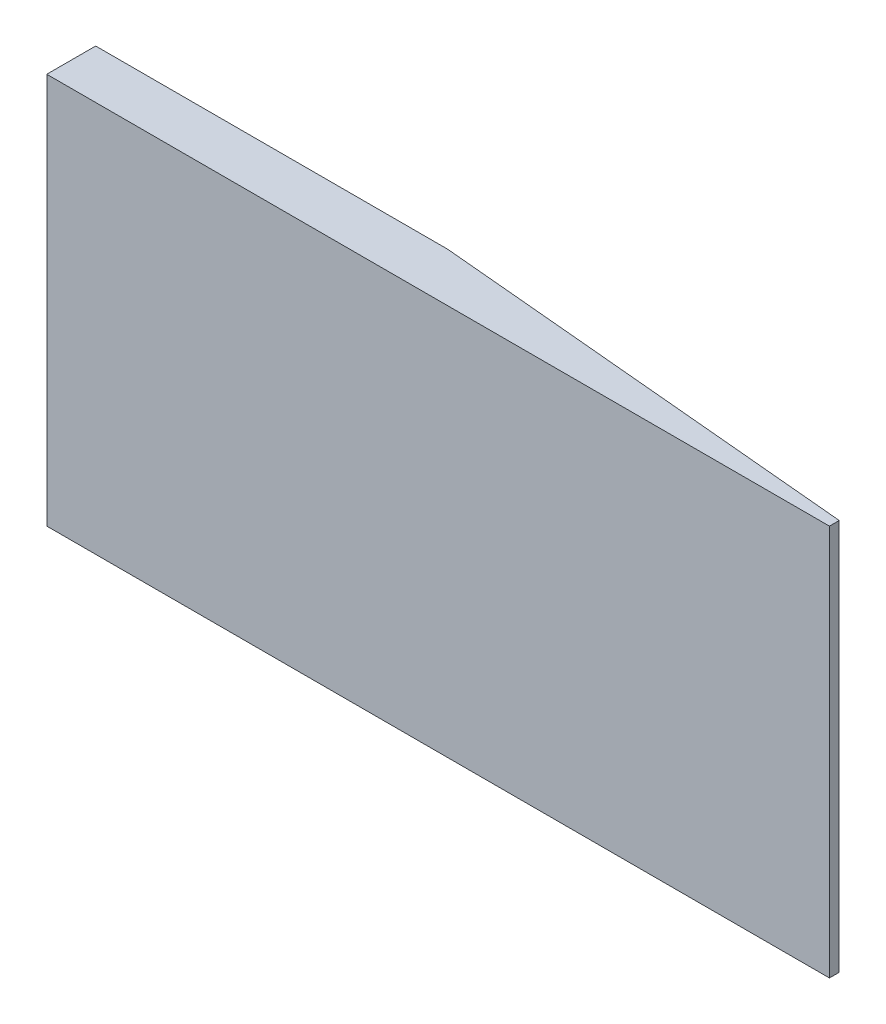
ISO-10303-21;
HEADER;
FILE_DESCRIPTION(('STEP AP214'),'2;1');
FILE_NAME('part.step','',(''),(''),'','','');
FILE_SCHEMA(('AUTOMOTIVE_DESIGN { 1 0 10303 214 1 1 1 1 }'));
ENDSEC;
DATA;
#1=APPLICATION_CONTEXT('core data for automotive mechanical design processes');
#2=APPLICATION_PROTOCOL_DEFINITION('international standard','automotive_design',2000,#1);
#3=PRODUCT_CONTEXT('',#1,'mechanical');
#4=PRODUCT('Part','Part','',(#3));
#5=PRODUCT_RELATED_PRODUCT_CATEGORY('part','',(#4));
#6=PRODUCT_DEFINITION_FORMATION('','',#4);
#7=PRODUCT_DEFINITION_CONTEXT('part definition',#1,'design');
#8=PRODUCT_DEFINITION('design','',#6,#7);
#9=PRODUCT_DEFINITION_SHAPE('','',#8);
#10=(LENGTH_UNIT() NAMED_UNIT(*) SI_UNIT(.MILLI.,.METRE.));
#11=(NAMED_UNIT(*) PLANE_ANGLE_UNIT() SI_UNIT($,.RADIAN.));
#12=(NAMED_UNIT(*) SI_UNIT($,.STERADIAN.) SOLID_ANGLE_UNIT());
#13=UNCERTAINTY_MEASURE_WITH_UNIT(LENGTH_MEASURE(1.E-05),#10,'distance_accuracy_value','');
#14=(GEOMETRIC_REPRESENTATION_CONTEXT(3) GLOBAL_UNCERTAINTY_ASSIGNED_CONTEXT((#13)) GLOBAL_UNIT_ASSIGNED_CONTEXT((#10,
#11,#12)) REPRESENTATION_CONTEXT('',''));
#15=CARTESIAN_POINT('',(0.,0.,0.));
#16=DIRECTION('',(0.,0.,1.));
#17=DIRECTION('',(1.,0.,0.));
#18=AXIS2_PLACEMENT_3D('',#15,#16,#17);
#19=CARTESIAN_POINT('',(194.704652045804,14.2875,3.175));
#20=DIRECTION('',(1.,0.,0.));
#21=DIRECTION('',(0.,0.,-1.));
#22=AXIS2_PLACEMENT_3D('',#19,#20,#21);
#23=PLANE('',#22);
#24=DIRECTION('',(0.,-1.,0.));
#25=VECTOR('',#24,1.);
#26=CARTESIAN_POINT('',(194.704652045804,14.2875,0.));
#27=LINE('',#26,#25);
#28=CARTESIAN_POINT('',(194.704652045804,14.2875,0.));
#29=VERTEX_POINT('',#28);
#30=CARTESIAN_POINT('',(194.704652045804,-11.1125,0.));
#31=VERTEX_POINT('',#30);
#32=EDGE_CURVE('E110',#29,#31,#27,.T.);
#33=ORIENTED_EDGE('',*,*,#32,.T.);
#34=DIRECTION('',(0.,0.,-1.));
#35=VECTOR('',#34,1.);
#36=CARTESIAN_POINT('',(194.704652045804,-11.1125,3.175));
#37=LINE('',#36,#35);
#38=CARTESIAN_POINT('',(194.704652045804,-11.1125,3.175));
#39=VERTEX_POINT('',#38);
#40=EDGE_CURVE('E91',#39,#31,#37,.T.);
#41=ORIENTED_EDGE('',*,*,#40,.F.);
#42=DIRECTION('',(0.,-1.,0.));
#43=VECTOR('',#42,1.);
#44=CARTESIAN_POINT('',(194.704652045804,14.2875,3.175));
#45=LINE('',#44,#43);
#46=CARTESIAN_POINT('',(194.704652045804,14.2875,3.175));
#47=VERTEX_POINT('',#46);
#48=EDGE_CURVE('E98',#47,#39,#45,.T.);
#49=ORIENTED_EDGE('',*,*,#48,.F.);
#50=DIRECTION('',(0.,0.,-1.));
#51=VECTOR('',#50,1.);
#52=CARTESIAN_POINT('',(194.704652045804,14.2875,3.175));
#53=LINE('',#52,#51);
#54=EDGE_CURVE('E120',#47,#29,#53,.T.);
#55=ORIENTED_EDGE('',*,*,#54,.T.);
#56=EDGE_LOOP('',(#33,#41,#49,#55));
#57=FACE_BOUND('',#56,.T.);
#58=ADVANCED_FACE('F41',(#57),#23,.F.);
#59=CARTESIAN_POINT('',(194.704652045804,-11.1125,3.175));
#60=DIRECTION('',(0.,1.,0.));
#61=DIRECTION('',(0.,0.,1.));
#62=AXIS2_PLACEMENT_3D('',#59,#60,#61);
#63=PLANE('',#62);
#64=DIRECTION('',(1.,0.,0.));
#65=VECTOR('',#64,1.);
#66=CARTESIAN_POINT('',(194.704652045804,-11.1125,0.));
#67=LINE('',#66,#65);
#68=CARTESIAN_POINT('',(217.564652045803,-11.1125,0.));
#69=VERTEX_POINT('',#68);
#70=EDGE_CURVE('E123',#31,#69,#67,.T.);
#71=ORIENTED_EDGE('',*,*,#70,.T.);
#72=DIRECTION('',(-0.995893206467704,0.,-0.0905357460425151));
#73=VECTOR('',#72,1.);
#74=CARTESIAN_POINT('',(245.504652045804,-11.1125,2.54));
#75=LINE('',#74,#73);
#76=CARTESIAN_POINT('',(245.504652045804,-11.1125,2.54));
#77=VERTEX_POINT('',#76);
#78=EDGE_CURVE('E11',#69,#77,#75,.F.);
#79=ORIENTED_EDGE('',*,*,#78,.T.);
#80=DIRECTION('',(0.,0.,-1.));
#81=VECTOR('',#80,1.);
#82=CARTESIAN_POINT('',(245.504652045804,-11.1125,3.175));
#83=LINE('',#82,#81);
#84=CARTESIAN_POINT('',(245.504652045804,-11.1125,3.175));
#85=VERTEX_POINT('',#84);
#86=EDGE_CURVE('E94',#85,#77,#83,.T.);
#87=ORIENTED_EDGE('',*,*,#86,.F.);
#88=DIRECTION('',(1.,0.,0.));
#89=VECTOR('',#88,1.);
#90=CARTESIAN_POINT('',(194.704652045804,-11.1125,3.175));
#91=LINE('',#90,#89);
#92=EDGE_CURVE('E87',#39,#85,#91,.T.);
#93=ORIENTED_EDGE('',*,*,#92,.F.);
#94=ORIENTED_EDGE('',*,*,#40,.T.);
#95=EDGE_LOOP('',(#71,#79,#87,#93,#94));
#96=FACE_BOUND('',#95,.T.);
#97=ADVANCED_FACE('F89',(#96),#63,.F.);
#98=CARTESIAN_POINT('',(245.504652045804,14.2875,3.175));
#99=DIRECTION('',(-1.,0.,0.));
#100=DIRECTION('',(0.,0.,1.));
#101=AXIS2_PLACEMENT_3D('',#98,#99,#100);
#102=PLANE('',#101);
#103=ORIENTED_EDGE('',*,*,#86,.T.);
#104=DIRECTION('',(0.,1.,0.));
#105=VECTOR('',#104,1.);
#106=CARTESIAN_POINT('',(245.504652045804,14.2875,2.54));
#107=LINE('',#106,#105);
#108=CARTESIAN_POINT('',(245.504652045804,14.2875,2.54));
#109=VERTEX_POINT('',#108);
#110=EDGE_CURVE('E111',#77,#109,#107,.T.);
#111=ORIENTED_EDGE('',*,*,#110,.T.);
#112=DIRECTION('',(0.,0.,-1.));
#113=VECTOR('',#112,1.);
#114=CARTESIAN_POINT('',(245.504652045804,14.2875,3.175));
#115=LINE('',#114,#113);
#116=CARTESIAN_POINT('',(245.504652045804,14.2875,3.175));
#117=VERTEX_POINT('',#116);
#118=EDGE_CURVE('E115',#117,#109,#115,.T.);
#119=ORIENTED_EDGE('',*,*,#118,.F.);
#120=DIRECTION('',(0.,1.,0.));
#121=VECTOR('',#120,1.);
#122=CARTESIAN_POINT('',(245.504652045804,14.2875,3.175));
#123=LINE('',#122,#121);
#124=EDGE_CURVE('E97',#85,#117,#123,.T.);
#125=ORIENTED_EDGE('',*,*,#124,.F.);
#126=EDGE_LOOP('',(#103,#111,#119,#125));
#127=FACE_BOUND('',#126,.T.);
#128=ADVANCED_FACE('F129',(#127),#102,.F.);
#129=CARTESIAN_POINT('',(194.704652045804,14.2875,3.175));
#130=DIRECTION('',(0.,-1.,0.));
#131=DIRECTION('',(0.,0.,-1.));
#132=AXIS2_PLACEMENT_3D('',#129,#130,#131);
#133=PLANE('',#132);
#134=ORIENTED_EDGE('',*,*,#118,.T.);
#135=DIRECTION('',(0.995893206467704,0.,0.0905357460425151));
#136=VECTOR('',#135,1.);
#137=CARTESIAN_POINT('',(245.504652045804,14.2875,2.54));
#138=LINE('',#137,#136);
#139=CARTESIAN_POINT('',(217.564652045803,14.2875,0.));
#140=VERTEX_POINT('',#139);
#141=EDGE_CURVE('E64',#109,#140,#138,.F.);
#142=ORIENTED_EDGE('',*,*,#141,.T.);
#143=DIRECTION('',(-1.,0.,0.));
#144=VECTOR('',#143,1.);
#145=CARTESIAN_POINT('',(194.704652045804,14.2875,0.));
#146=LINE('',#145,#144);
#147=EDGE_CURVE('E107',#140,#29,#146,.T.);
#148=ORIENTED_EDGE('',*,*,#147,.T.);
#149=ORIENTED_EDGE('',*,*,#54,.F.);
#150=DIRECTION('',(-1.,0.,0.));
#151=VECTOR('',#150,1.);
#152=CARTESIAN_POINT('',(194.704652045804,14.2875,3.175));
#153=LINE('',#152,#151);
#154=EDGE_CURVE('E103',#117,#47,#153,.T.);
#155=ORIENTED_EDGE('',*,*,#154,.F.);
#156=EDGE_LOOP('',(#134,#142,#148,#149,#155));
#157=FACE_BOUND('',#156,.T.);
#158=ADVANCED_FACE('F131',(#157),#133,.F.);
#159=CARTESIAN_POINT('',(0.,0.,3.175));
#160=DIRECTION('',(0.,0.,1.));
#161=DIRECTION('',(1.,0.,0.));
#162=AXIS2_PLACEMENT_3D('',#159,#160,#161);
#163=PLANE('',#162);
#164=ORIENTED_EDGE('',*,*,#48,.T.);
#165=ORIENTED_EDGE('',*,*,#92,.T.);
#166=ORIENTED_EDGE('',*,*,#124,.T.);
#167=ORIENTED_EDGE('',*,*,#154,.T.);
#168=EDGE_LOOP('',(#164,#165,#166,#167));
#169=FACE_BOUND('',#168,.T.);
#170=ADVANCED_FACE('F101',(#169),#163,.T.);
#171=CARTESIAN_POINT('',(0.,0.,0.));
#172=DIRECTION('',(0.,0.,1.));
#173=DIRECTION('',(1.,0.,0.));
#174=AXIS2_PLACEMENT_3D('',#171,#172,#173);
#175=PLANE('',#174);
#176=ORIENTED_EDGE('',*,*,#147,.F.);
#177=DIRECTION('',(0.,-1.,0.));
#178=VECTOR('',#177,1.);
#179=CARTESIAN_POINT('',(217.564652045803,0.,0.));
#180=LINE('',#179,#178);
#181=EDGE_CURVE('E50',#140,#69,#180,.T.);
#182=ORIENTED_EDGE('',*,*,#181,.T.);
#183=ORIENTED_EDGE('',*,*,#70,.F.);
#184=ORIENTED_EDGE('',*,*,#32,.F.);
#185=EDGE_LOOP('',(#176,#182,#183,#184));
#186=FACE_BOUND('',#185,.T.);
#187=ADVANCED_FACE('F132',(#186),#175,.F.);
#188=CARTESIAN_POINT('',(245.504652045804,14.2875,2.54));
#189=DIRECTION('',(-0.0905357460425151,0.,0.995893206467704));
#190=DIRECTION('',(0.,1.,0.));
#191=AXIS2_PLACEMENT_3D('',#188,#189,#190);
#192=PLANE('',#191);
#193=ORIENTED_EDGE('',*,*,#78,.F.);
#194=ORIENTED_EDGE('',*,*,#181,.F.);
#195=ORIENTED_EDGE('',*,*,#141,.F.);
#196=ORIENTED_EDGE('',*,*,#110,.F.);
#197=EDGE_LOOP('',(#193,#194,#195,#196));
#198=FACE_BOUND('',#197,.T.);
#199=ADVANCED_FACE('F44',(#198),#192,.F.);
#200=CLOSED_SHELL('',(#58,#97,#128,#158,#170,#187,#199));
#201=MANIFOLD_SOLID_BREP('B2',#200);
#202=ADVANCED_BREP_SHAPE_REPRESENTATION('',(#18,#201),#14);
#203=SHAPE_DEFINITION_REPRESENTATION(#9,#202);
ENDSEC;
END-ISO-10303-21;
